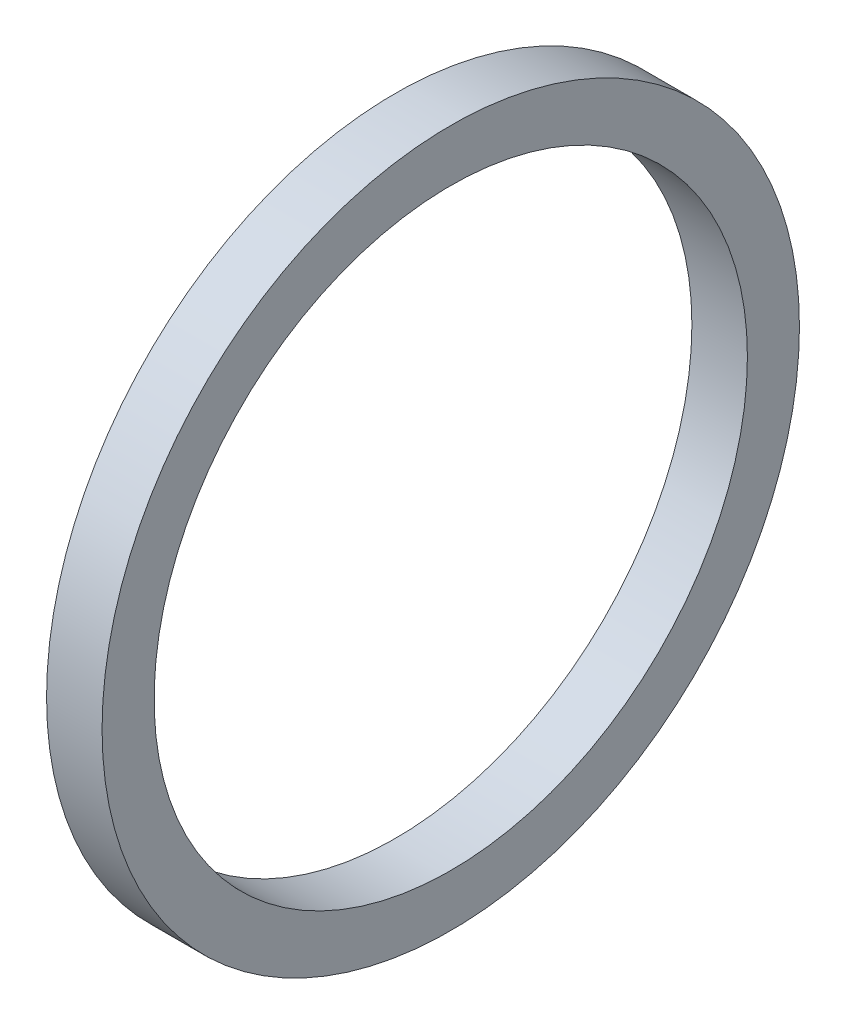
ISO-10303-21;
HEADER;
FILE_DESCRIPTION(('STEP AP214'),'2;1');
FILE_NAME('part.step','',(''),(''),'','','');
FILE_SCHEMA(('AUTOMOTIVE_DESIGN { 1 0 10303 214 1 1 1 1 }'));
ENDSEC;
DATA;
#1=APPLICATION_CONTEXT('core data for automotive mechanical design processes');
#2=APPLICATION_PROTOCOL_DEFINITION('international standard','automotive_design',2000,#1);
#3=PRODUCT_CONTEXT('',#1,'mechanical');
#4=PRODUCT('Part','Part','',(#3));
#5=PRODUCT_RELATED_PRODUCT_CATEGORY('part','',(#4));
#6=PRODUCT_DEFINITION_FORMATION('','',#4);
#7=PRODUCT_DEFINITION_CONTEXT('part definition',#1,'design');
#8=PRODUCT_DEFINITION('design','',#6,#7);
#9=PRODUCT_DEFINITION_SHAPE('','',#8);
#10=(LENGTH_UNIT() NAMED_UNIT(*) SI_UNIT(.MILLI.,.METRE.));
#11=(NAMED_UNIT(*) PLANE_ANGLE_UNIT() SI_UNIT($,.RADIAN.));
#12=(NAMED_UNIT(*) SI_UNIT($,.STERADIAN.) SOLID_ANGLE_UNIT());
#13=UNCERTAINTY_MEASURE_WITH_UNIT(LENGTH_MEASURE(1.E-05),#10,'distance_accuracy_value','');
#14=(GEOMETRIC_REPRESENTATION_CONTEXT(3) GLOBAL_UNCERTAINTY_ASSIGNED_CONTEXT((#13)) GLOBAL_UNIT_ASSIGNED_CONTEXT((#10,
#11,#12)) REPRESENTATION_CONTEXT('',''));
#15=CARTESIAN_POINT('',(0.,0.,0.));
#16=DIRECTION('',(0.,0.,1.));
#17=DIRECTION('',(1.,0.,0.));
#18=AXIS2_PLACEMENT_3D('',#15,#16,#17);
#19=CARTESIAN_POINT('',(3.2,0.,0.));
#20=DIRECTION('',(1.,0.,0.));
#21=DIRECTION('',(0.,0.,-1.));
#22=AXIS2_PLACEMENT_3D('',#19,#20,#21);
#23=PLANE('',#22);
#24=CARTESIAN_POINT('',(3.2,0.,0.));
#25=DIRECTION('',(1.,0.,0.));
#26=DIRECTION('',(0.,0.,-1.));
#27=AXIS2_PLACEMENT_3D('',#24,#25,#26);
#28=CIRCLE('',#27,20.1);
#29=CARTESIAN_POINT('',(3.2,0.,-20.1));
#30=VERTEX_POINT('',#29);
#31=EDGE_CURVE('E11',#30,#30,#28,.T.);
#32=ORIENTED_EDGE('',*,*,#31,.T.);
#33=EDGE_LOOP('',(#32));
#34=FACE_BOUND('',#33,.T.);
#35=CARTESIAN_POINT('',(3.2,0.,0.));
#36=DIRECTION('',(1.,0.,0.));
#37=DIRECTION('',(0.,0.,-1.));
#38=AXIS2_PLACEMENT_3D('',#35,#36,#37);
#39=CIRCLE('',#38,17.1);
#40=CARTESIAN_POINT('',(3.2,0.,-17.1));
#41=VERTEX_POINT('',#40);
#42=EDGE_CURVE('E49',#41,#41,#39,.T.);
#43=ORIENTED_EDGE('',*,*,#42,.F.);
#44=EDGE_LOOP('',(#43));
#45=FACE_BOUND('',#44,.T.);
#46=ADVANCED_FACE('F38',(#34,#45),#23,.T.);
#47=CARTESIAN_POINT('',(0.,0.,0.));
#48=DIRECTION('',(1.,0.,0.));
#49=DIRECTION('',(0.,0.,-1.));
#50=AXIS2_PLACEMENT_3D('',#47,#48,#49);
#51=PLANE('',#50);
#52=CARTESIAN_POINT('',(0.,0.,0.));
#53=DIRECTION('',(1.,0.,0.));
#54=DIRECTION('',(0.,0.,-1.));
#55=AXIS2_PLACEMENT_3D('',#52,#53,#54);
#56=CIRCLE('',#55,20.1);
#57=CARTESIAN_POINT('',(0.,0.,-20.1));
#58=VERTEX_POINT('',#57);
#59=EDGE_CURVE('E42',#58,#58,#56,.T.);
#60=ORIENTED_EDGE('',*,*,#59,.F.);
#61=EDGE_LOOP('',(#60));
#62=FACE_BOUND('',#61,.T.);
#63=CARTESIAN_POINT('',(0.,0.,0.));
#64=DIRECTION('',(1.,0.,0.));
#65=DIRECTION('',(0.,0.,-1.));
#66=AXIS2_PLACEMENT_3D('',#63,#64,#65);
#67=CIRCLE('',#66,17.1);
#68=CARTESIAN_POINT('',(0.,0.,-17.1));
#69=VERTEX_POINT('',#68);
#70=EDGE_CURVE('E51',#69,#69,#67,.T.);
#71=ORIENTED_EDGE('',*,*,#70,.T.);
#72=EDGE_LOOP('',(#71));
#73=FACE_BOUND('',#72,.T.);
#74=ADVANCED_FACE('F61',(#62,#73),#51,.F.);
#75=CARTESIAN_POINT('',(3.2,0.,0.));
#76=DIRECTION('',(-1.,0.,0.));
#77=DIRECTION('',(0.,0.,1.));
#78=AXIS2_PLACEMENT_3D('',#75,#76,#77);
#79=CYLINDRICAL_SURFACE('',#78,20.1);
#80=ORIENTED_EDGE('',*,*,#31,.F.);
#81=EDGE_LOOP('',(#80));
#82=FACE_BOUND('',#81,.T.);
#83=ORIENTED_EDGE('',*,*,#59,.T.);
#84=EDGE_LOOP('',(#83));
#85=FACE_BOUND('',#84,.T.);
#86=ADVANCED_FACE('F40',(#82,#85),#79,.T.);
#87=CARTESIAN_POINT('',(3.2,0.,0.));
#88=DIRECTION('',(-1.,0.,0.));
#89=DIRECTION('',(0.,0.,1.));
#90=AXIS2_PLACEMENT_3D('',#87,#88,#89);
#91=CYLINDRICAL_SURFACE('',#90,17.1);
#92=ORIENTED_EDGE('',*,*,#42,.T.);
#93=EDGE_LOOP('',(#92));
#94=FACE_BOUND('',#93,.T.);
#95=ORIENTED_EDGE('',*,*,#70,.F.);
#96=EDGE_LOOP('',(#95));
#97=FACE_BOUND('',#96,.T.);
#98=ADVANCED_FACE('F57',(#94,#97),#91,.F.);
#99=CLOSED_SHELL('',(#46,#74,#86,#98));
#100=MANIFOLD_SOLID_BREP('B2',#99);
#101=ADVANCED_BREP_SHAPE_REPRESENTATION('',(#18,#100),#14);
#102=SHAPE_DEFINITION_REPRESENTATION(#9,#101);
ENDSEC;
END-ISO-10303-21;
